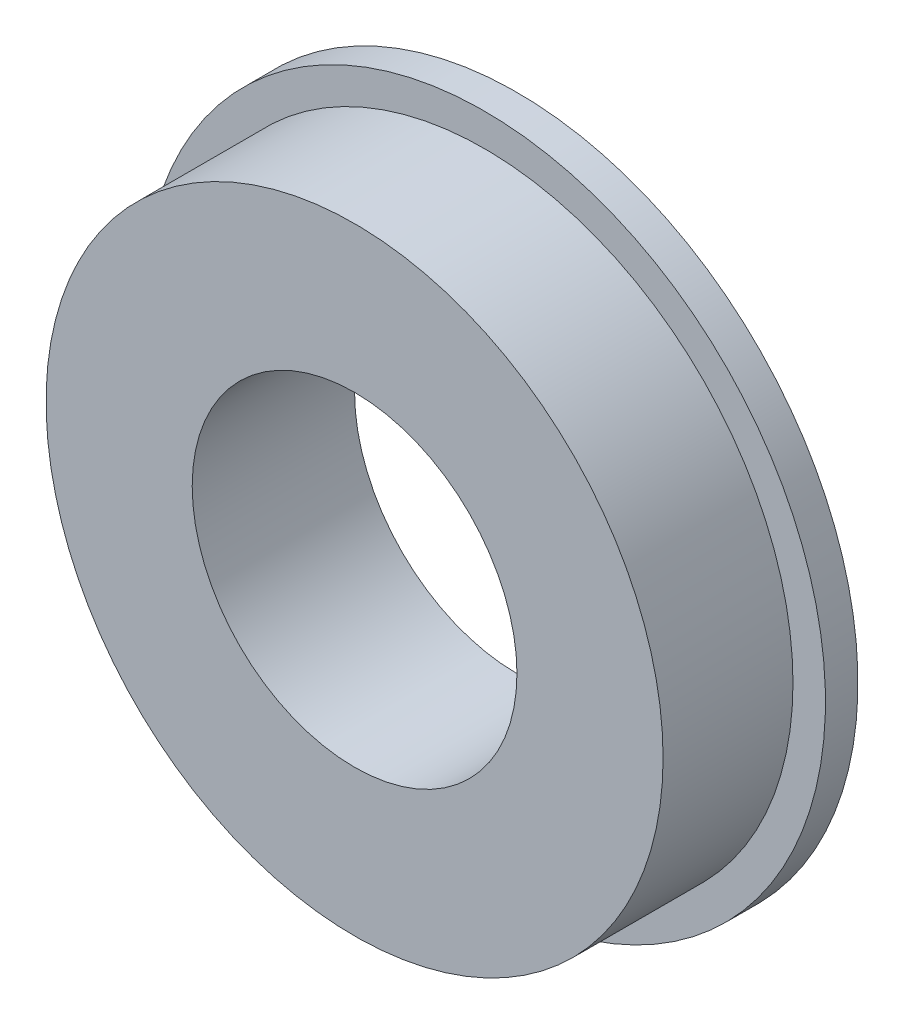
ISO-10303-21;
HEADER;
FILE_DESCRIPTION(('STEP AP214'),'2;1');
FILE_NAME('part.step','',(''),(''),'','','');
FILE_SCHEMA(('AUTOMOTIVE_DESIGN { 1 0 10303 214 1 1 1 1 }'));
ENDSEC;
DATA;
#1=APPLICATION_CONTEXT('core data for automotive mechanical design processes');
#2=APPLICATION_PROTOCOL_DEFINITION('international standard','automotive_design',2000,#1);
#3=PRODUCT_CONTEXT('',#1,'mechanical');
#4=PRODUCT('Part','Part','',(#3));
#5=PRODUCT_RELATED_PRODUCT_CATEGORY('part','',(#4));
#6=PRODUCT_DEFINITION_FORMATION('','',#4);
#7=PRODUCT_DEFINITION_CONTEXT('part definition',#1,'design');
#8=PRODUCT_DEFINITION('design','',#6,#7);
#9=PRODUCT_DEFINITION_SHAPE('','',#8);
#10=(LENGTH_UNIT() NAMED_UNIT(*) SI_UNIT(.MILLI.,.METRE.));
#11=(NAMED_UNIT(*) PLANE_ANGLE_UNIT() SI_UNIT($,.RADIAN.));
#12=(NAMED_UNIT(*) SI_UNIT($,.STERADIAN.) SOLID_ANGLE_UNIT());
#13=UNCERTAINTY_MEASURE_WITH_UNIT(LENGTH_MEASURE(1.E-05),#10,'distance_accuracy_value','');
#14=(GEOMETRIC_REPRESENTATION_CONTEXT(3) GLOBAL_UNCERTAINTY_ASSIGNED_CONTEXT((#13)) GLOBAL_UNIT_ASSIGNED_CONTEXT((#10,
#11,#12)) REPRESENTATION_CONTEXT('',''));
#15=CARTESIAN_POINT('',(0.,0.,0.));
#16=DIRECTION('',(0.,0.,1.));
#17=DIRECTION('',(1.,0.,0.));
#18=AXIS2_PLACEMENT_3D('',#15,#16,#17);
#19=CARTESIAN_POINT('',(0.,0.,4.));
#20=DIRECTION('',(0.,0.,1.));
#21=DIRECTION('',(1.,0.,0.));
#22=AXIS2_PLACEMENT_3D('',#19,#20,#21);
#23=PLANE('',#22);
#24=CARTESIAN_POINT('',(0.,0.,4.));
#25=DIRECTION('',(0.,0.,1.));
#26=DIRECTION('',(1.,0.,0.));
#27=AXIS2_PLACEMENT_3D('',#24,#25,#26);
#28=CIRCLE('',#27,9.5);
#29=CARTESIAN_POINT('',(9.5,0.,4.));
#30=VERTEX_POINT('',#29);
#31=EDGE_CURVE('E10',#30,#30,#28,.T.);
#32=ORIENTED_EDGE('',*,*,#31,.T.);
#33=EDGE_LOOP('',(#32));
#34=FACE_BOUND('',#33,.T.);
#35=CARTESIAN_POINT('',(0.,0.,4.));
#36=DIRECTION('',(0.,0.,1.));
#37=DIRECTION('',(1.,0.,0.));
#38=AXIS2_PLACEMENT_3D('',#35,#36,#37);
#39=CIRCLE('',#38,5.);
#40=CARTESIAN_POINT('',(5.,0.,4.));
#41=VERTEX_POINT('',#40);
#42=EDGE_CURVE('E42',#41,#41,#39,.T.);
#43=ORIENTED_EDGE('',*,*,#42,.F.);
#44=EDGE_LOOP('',(#43));
#45=FACE_BOUND('',#44,.T.);
#46=ADVANCED_FACE('F34',(#34,#45),#23,.T.);
#47=CARTESIAN_POINT('',(0.,0.,4.));
#48=DIRECTION('',(0.,0.,-1.));
#49=DIRECTION('',(-1.,0.,0.));
#50=AXIS2_PLACEMENT_3D('',#47,#48,#49);
#51=CYLINDRICAL_SURFACE('',#50,9.5);
#52=ORIENTED_EDGE('',*,*,#31,.F.);
#53=EDGE_LOOP('',(#52));
#54=FACE_BOUND('',#53,.T.);
#55=CARTESIAN_POINT('',(0.,0.,0.));
#56=DIRECTION('',(0.,0.,1.));
#57=DIRECTION('',(1.,0.,0.));
#58=AXIS2_PLACEMENT_3D('',#55,#56,#57);
#59=CIRCLE('',#58,9.5);
#60=CARTESIAN_POINT('',(9.5,0.,0.));
#61=VERTEX_POINT('',#60);
#62=EDGE_CURVE('E38',#61,#61,#59,.T.);
#63=ORIENTED_EDGE('',*,*,#62,.T.);
#64=EDGE_LOOP('',(#63));
#65=FACE_BOUND('',#64,.T.);
#66=ADVANCED_FACE('F36',(#54,#65),#51,.T.);
#67=CARTESIAN_POINT('',(0.,0.,4.));
#68=DIRECTION('',(0.,0.,-1.));
#69=DIRECTION('',(-1.,0.,0.));
#70=AXIS2_PLACEMENT_3D('',#67,#68,#69);
#71=CYLINDRICAL_SURFACE('',#70,5.);
#72=ORIENTED_EDGE('',*,*,#42,.T.);
#73=EDGE_LOOP('',(#72));
#74=FACE_BOUND('',#73,.T.);
#75=CARTESIAN_POINT('',(0.,0.,-1.));
#76=DIRECTION('',(0.,0.,-1.));
#77=DIRECTION('',(-1.,0.,0.));
#78=AXIS2_PLACEMENT_3D('',#75,#76,#77);
#79=CIRCLE('',#78,5.);
#80=CARTESIAN_POINT('',(-5.,0.,-1.));
#81=VERTEX_POINT('',#80);
#82=EDGE_CURVE('E52',#81,#81,#79,.T.);
#83=ORIENTED_EDGE('',*,*,#82,.T.);
#84=EDGE_LOOP('',(#83));
#85=FACE_BOUND('',#84,.T.);
#86=ADVANCED_FACE('F58',(#74,#85),#71,.F.);
#87=CARTESIAN_POINT('',(0.,0.,-1.));
#88=DIRECTION('',(0.,0.,-1.));
#89=DIRECTION('',(-1.,0.,0.));
#90=AXIS2_PLACEMENT_3D('',#87,#88,#89);
#91=PLANE('',#90);
#92=CARTESIAN_POINT('',(0.,0.,-1.));
#93=DIRECTION('',(0.,0.,-1.));
#94=DIRECTION('',(-1.,0.,0.));
#95=AXIS2_PLACEMENT_3D('',#92,#93,#94);
#96=CIRCLE('',#95,10.5);
#97=CARTESIAN_POINT('',(-10.5,0.,-1.));
#98=VERTEX_POINT('',#97);
#99=EDGE_CURVE('E51',#98,#98,#96,.T.);
#100=ORIENTED_EDGE('',*,*,#99,.T.);
#101=EDGE_LOOP('',(#100));
#102=FACE_BOUND('',#101,.T.);
#103=ORIENTED_EDGE('',*,*,#82,.F.);
#104=EDGE_LOOP('',(#103));
#105=FACE_BOUND('',#104,.T.);
#106=ADVANCED_FACE('F60',(#102,#105),#91,.T.);
#107=CARTESIAN_POINT('',(0.,0.,0.));
#108=DIRECTION('',(0.,0.,-1.));
#109=DIRECTION('',(-1.,0.,0.));
#110=AXIS2_PLACEMENT_3D('',#107,#108,#109);
#111=PLANE('',#110);
#112=ORIENTED_EDGE('',*,*,#62,.F.);
#113=EDGE_LOOP('',(#112));
#114=FACE_BOUND('',#113,.T.);
#115=CARTESIAN_POINT('',(0.,0.,0.));
#116=DIRECTION('',(0.,0.,-1.));
#117=DIRECTION('',(-1.,0.,0.));
#118=AXIS2_PLACEMENT_3D('',#115,#116,#117);
#119=CIRCLE('',#118,10.5);
#120=CARTESIAN_POINT('',(-10.5,0.,0.));
#121=VERTEX_POINT('',#120);
#122=EDGE_CURVE('E48',#121,#121,#119,.T.);
#123=ORIENTED_EDGE('',*,*,#122,.F.);
#124=EDGE_LOOP('',(#123));
#125=FACE_BOUND('',#124,.T.);
#126=ADVANCED_FACE('F62',(#114,#125),#111,.F.);
#127=CARTESIAN_POINT('',(0.,0.,-1.));
#128=DIRECTION('',(0.,0.,1.));
#129=DIRECTION('',(1.,0.,0.));
#130=AXIS2_PLACEMENT_3D('',#127,#128,#129);
#131=CYLINDRICAL_SURFACE('',#130,10.5);
#132=ORIENTED_EDGE('',*,*,#99,.F.);
#133=EDGE_LOOP('',(#132));
#134=FACE_BOUND('',#133,.T.);
#135=ORIENTED_EDGE('',*,*,#122,.T.);
#136=EDGE_LOOP('',(#135));
#137=FACE_BOUND('',#136,.T.);
#138=ADVANCED_FACE('F69',(#134,#137),#131,.T.);
#139=CLOSED_SHELL('',(#46,#66,#86,#106,#126,#138));
#140=MANIFOLD_SOLID_BREP('B2',#139);
#141=ADVANCED_BREP_SHAPE_REPRESENTATION('',(#18,#140),#14);
#142=SHAPE_DEFINITION_REPRESENTATION(#9,#141);
ENDSEC;
END-ISO-10303-21;
